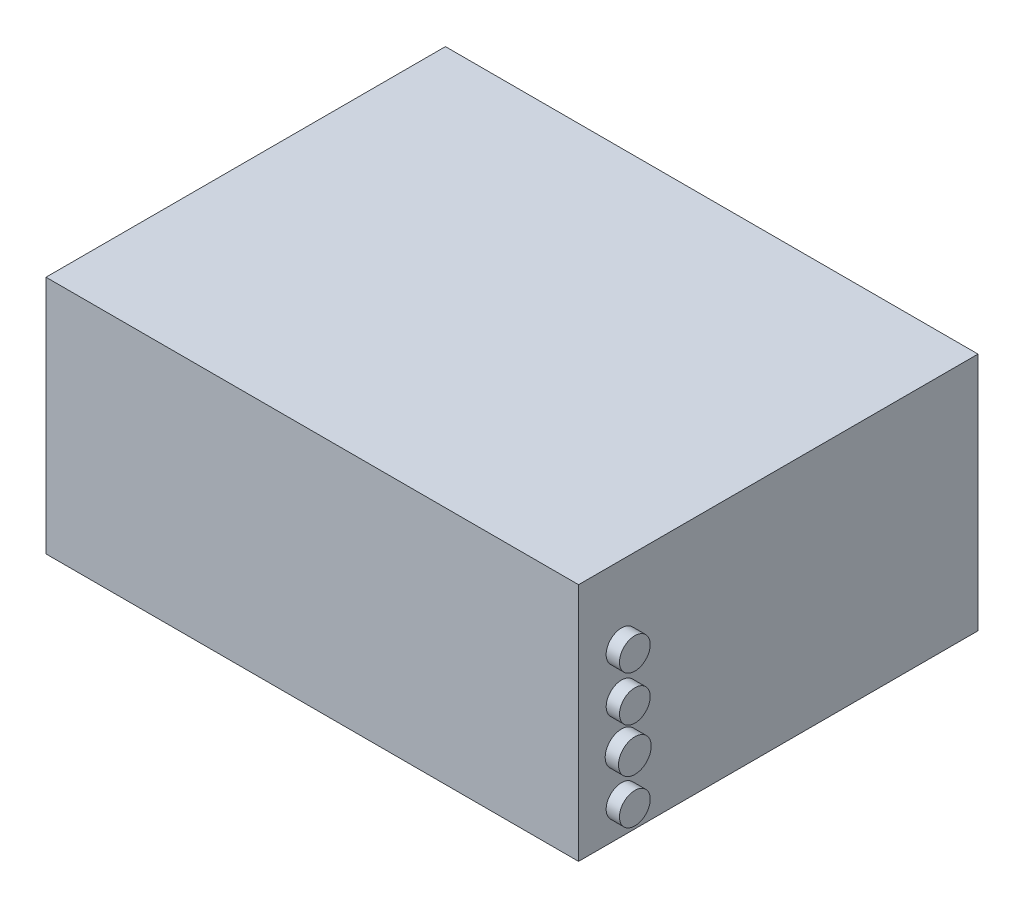
ISO-10303-21;
HEADER;
FILE_DESCRIPTION(('STEP AP214'),'2;1');
FILE_NAME('part.step','',(''),(''),'','','');
FILE_SCHEMA(('AUTOMOTIVE_DESIGN { 1 0 10303 214 1 1 1 1 }'));
ENDSEC;
DATA;
#1=APPLICATION_CONTEXT('core data for automotive mechanical design processes');
#2=APPLICATION_PROTOCOL_DEFINITION('international standard','automotive_design',2000,#1);
#3=PRODUCT_CONTEXT('',#1,'mechanical');
#4=PRODUCT('Part','Part','',(#3));
#5=PRODUCT_RELATED_PRODUCT_CATEGORY('part','',(#4));
#6=PRODUCT_DEFINITION_FORMATION('','',#4);
#7=PRODUCT_DEFINITION_CONTEXT('part definition',#1,'design');
#8=PRODUCT_DEFINITION('design','',#6,#7);
#9=PRODUCT_DEFINITION_SHAPE('','',#8);
#10=(LENGTH_UNIT() NAMED_UNIT(*) SI_UNIT(.MILLI.,.METRE.));
#11=(NAMED_UNIT(*) PLANE_ANGLE_UNIT() SI_UNIT($,.RADIAN.));
#12=(NAMED_UNIT(*) SI_UNIT($,.STERADIAN.) SOLID_ANGLE_UNIT());
#13=UNCERTAINTY_MEASURE_WITH_UNIT(LENGTH_MEASURE(1.E-05),#10,'distance_accuracy_value','');
#14=(GEOMETRIC_REPRESENTATION_CONTEXT(3) GLOBAL_UNCERTAINTY_ASSIGNED_CONTEXT((#13)) GLOBAL_UNIT_ASSIGNED_CONTEXT((#10,
#11,#12)) REPRESENTATION_CONTEXT('',''));
#15=CARTESIAN_POINT('',(0.,0.,0.));
#16=DIRECTION('',(0.,0.,1.));
#17=DIRECTION('',(1.,0.,0.));
#18=AXIS2_PLACEMENT_3D('',#15,#16,#17);
#19=CARTESIAN_POINT('',(100.,90.,-75.));
#20=DIRECTION('',(-1.,0.,0.));
#21=DIRECTION('',(0.,0.,1.));
#22=AXIS2_PLACEMENT_3D('',#19,#20,#21);
#23=PLANE('',#22);
#24=CARTESIAN_POINT('',(100.,62.0845176881401,58.8639291254986));
#25=DIRECTION('',(-1.,0.,0.));
#26=DIRECTION('',(0.,0.,1.));
#27=AXIS2_PLACEMENT_3D('',#24,#25,#26);
#28=CIRCLE('',#27,5.78009430648381);
#29=CARTESIAN_POINT('',(100.,62.0845176881401,64.6440234319824));
#30=VERTEX_POINT('',#29);
#31=EDGE_CURVE('E11',#30,#30,#28,.F.);
#32=ORIENTED_EDGE('',*,*,#31,.F.);
#33=EDGE_LOOP('',(#32));
#34=FACE_BOUND('',#33,.T.);
#35=CARTESIAN_POINT('',(100.,45.1553137971656,58.8639291254986));
#36=DIRECTION('',(-1.,0.,0.));
#37=DIRECTION('',(0.,0.,1.));
#38=AXIS2_PLACEMENT_3D('',#35,#36,#37);
#39=CIRCLE('',#38,5.76546906701598);
#40=CARTESIAN_POINT('',(100.,45.1553137971656,64.6293981925146));
#41=VERTEX_POINT('',#40);
#42=EDGE_CURVE('E45',#41,#41,#39,.F.);
#43=ORIENTED_EDGE('',*,*,#42,.F.);
#44=EDGE_LOOP('',(#43));
#45=FACE_BOUND('',#44,.T.);
#46=CARTESIAN_POINT('',(100.,28.8473650948507,58.8639291254986));
#47=DIRECTION('',(-1.,0.,0.));
#48=DIRECTION('',(0.,0.,1.));
#49=AXIS2_PLACEMENT_3D('',#46,#47,#48);
#50=CIRCLE('',#49,6.14422637913083);
#51=CARTESIAN_POINT('',(100.,28.8473650948507,65.0081555046294));
#52=VERTEX_POINT('',#51);
#53=EDGE_CURVE('E129',#52,#52,#50,.F.);
#54=ORIENTED_EDGE('',*,*,#53,.F.);
#55=EDGE_LOOP('',(#54));
#56=FACE_BOUND('',#55,.T.);
#57=CARTESIAN_POINT('',(100.,11.7628474067113,58.8639291254986));
#58=DIRECTION('',(-1.,0.,0.));
#59=DIRECTION('',(0.,0.,1.));
#60=AXIS2_PLACEMENT_3D('',#57,#58,#59);
#61=CIRCLE('',#60,5.77800725304641);
#62=CARTESIAN_POINT('',(100.,11.7628474067113,64.641936378545));
#63=VERTEX_POINT('',#62);
#64=EDGE_CURVE('E126',#63,#63,#61,.F.);
#65=ORIENTED_EDGE('',*,*,#64,.F.);
#66=EDGE_LOOP('',(#65));
#67=FACE_BOUND('',#66,.T.);
#68=DIRECTION('',(0.,0.,-1.));
#69=VECTOR('',#68,1.);
#70=CARTESIAN_POINT('',(100.,0.,-75.));
#71=LINE('',#70,#69);
#72=CARTESIAN_POINT('',(100.,0.,75.));
#73=VERTEX_POINT('',#72);
#74=CARTESIAN_POINT('',(100.,0.,-75.));
#75=VERTEX_POINT('',#74);
#76=EDGE_CURVE('E104',#73,#75,#71,.T.);
#77=ORIENTED_EDGE('',*,*,#76,.T.);
#78=DIRECTION('',(0.,-1.,0.));
#79=VECTOR('',#78,1.);
#80=CARTESIAN_POINT('',(100.,90.,-75.));
#81=LINE('',#80,#79);
#82=CARTESIAN_POINT('',(100.,90.,-75.));
#83=VERTEX_POINT('',#82);
#84=EDGE_CURVE('E95',#83,#75,#81,.T.);
#85=ORIENTED_EDGE('',*,*,#84,.F.);
#86=DIRECTION('',(0.,0.,-1.));
#87=VECTOR('',#86,1.);
#88=CARTESIAN_POINT('',(100.,90.,-75.));
#89=LINE('',#88,#87);
#90=CARTESIAN_POINT('',(100.,90.,75.));
#91=VERTEX_POINT('',#90);
#92=EDGE_CURVE('E89',#91,#83,#89,.T.);
#93=ORIENTED_EDGE('',*,*,#92,.F.);
#94=DIRECTION('',(0.,-1.,0.));
#95=VECTOR('',#94,1.);
#96=CARTESIAN_POINT('',(100.,90.,75.));
#97=LINE('',#96,#95);
#98=EDGE_CURVE('E100',#91,#73,#97,.T.);
#99=ORIENTED_EDGE('',*,*,#98,.T.);
#100=EDGE_LOOP('',(#77,#85,#93,#99));
#101=FACE_BOUND('',#100,.T.);
#102=ADVANCED_FACE('F37',(#34,#45,#56,#67,#101),#23,.F.);
#103=CARTESIAN_POINT('',(-100.,90.,-75.));
#104=DIRECTION('',(0.,0.,1.));
#105=DIRECTION('',(1.,0.,0.));
#106=AXIS2_PLACEMENT_3D('',#103,#104,#105);
#107=PLANE('',#106);
#108=DIRECTION('',(-1.,0.,0.));
#109=VECTOR('',#108,1.);
#110=CARTESIAN_POINT('',(-100.,0.,-75.));
#111=LINE('',#110,#109);
#112=CARTESIAN_POINT('',(-100.,0.,-75.));
#113=VERTEX_POINT('',#112);
#114=EDGE_CURVE('E94',#75,#113,#111,.T.);
#115=ORIENTED_EDGE('',*,*,#114,.T.);
#116=DIRECTION('',(0.,-1.,0.));
#117=VECTOR('',#116,1.);
#118=CARTESIAN_POINT('',(-100.,90.,-75.));
#119=LINE('',#118,#117);
#120=CARTESIAN_POINT('',(-100.,90.,-75.));
#121=VERTEX_POINT('',#120);
#122=EDGE_CURVE('E92',#121,#113,#119,.T.);
#123=ORIENTED_EDGE('',*,*,#122,.F.);
#124=DIRECTION('',(-1.,0.,0.));
#125=VECTOR('',#124,1.);
#126=CARTESIAN_POINT('',(-100.,90.,-75.));
#127=LINE('',#126,#125);
#128=EDGE_CURVE('E84',#83,#121,#127,.T.);
#129=ORIENTED_EDGE('',*,*,#128,.F.);
#130=ORIENTED_EDGE('',*,*,#84,.T.);
#131=EDGE_LOOP('',(#115,#123,#129,#130));
#132=FACE_BOUND('',#131,.T.);
#133=ADVANCED_FACE('F93',(#132),#107,.F.);
#134=CARTESIAN_POINT('',(-100.,90.,-75.));
#135=DIRECTION('',(1.,0.,0.));
#136=DIRECTION('',(0.,0.,-1.));
#137=AXIS2_PLACEMENT_3D('',#134,#135,#136);
#138=PLANE('',#137);
#139=CARTESIAN_POINT('',(-100.,62.0845176881401,58.8639291254986));
#140=DIRECTION('',(1.,0.,0.));
#141=DIRECTION('',(0.,0.,-1.));
#142=AXIS2_PLACEMENT_3D('',#139,#140,#141);
#143=CIRCLE('',#142,5.78009430648381);
#144=CARTESIAN_POINT('',(-100.,62.0845176881401,53.0838348190148));
#145=VERTEX_POINT('',#144);
#146=EDGE_CURVE('E123',#145,#145,#143,.F.);
#147=ORIENTED_EDGE('',*,*,#146,.F.);
#148=EDGE_LOOP('',(#147));
#149=FACE_BOUND('',#148,.T.);
#150=CARTESIAN_POINT('',(-100.,45.1553137971656,58.8639291254986));
#151=DIRECTION('',(1.,0.,0.));
#152=DIRECTION('',(0.,0.,-1.));
#153=AXIS2_PLACEMENT_3D('',#150,#151,#152);
#154=CIRCLE('',#153,5.76546906701598);
#155=CARTESIAN_POINT('',(-100.,45.1553137971656,53.0984600584826));
#156=VERTEX_POINT('',#155);
#157=EDGE_CURVE('E120',#156,#156,#154,.F.);
#158=ORIENTED_EDGE('',*,*,#157,.F.);
#159=EDGE_LOOP('',(#158));
#160=FACE_BOUND('',#159,.T.);
#161=CARTESIAN_POINT('',(-100.,28.8473650948507,58.8639291254986));
#162=DIRECTION('',(1.,0.,0.));
#163=DIRECTION('',(0.,0.,-1.));
#164=AXIS2_PLACEMENT_3D('',#161,#162,#163);
#165=CIRCLE('',#164,6.14422637913083);
#166=CARTESIAN_POINT('',(-100.,28.8473650948507,52.7197027463678));
#167=VERTEX_POINT('',#166);
#168=EDGE_CURVE('E117',#167,#167,#165,.F.);
#169=ORIENTED_EDGE('',*,*,#168,.F.);
#170=EDGE_LOOP('',(#169));
#171=FACE_BOUND('',#170,.T.);
#172=CARTESIAN_POINT('',(-100.,11.7628474067113,58.8639291254986));
#173=DIRECTION('',(1.,0.,0.));
#174=DIRECTION('',(0.,0.,-1.));
#175=AXIS2_PLACEMENT_3D('',#172,#173,#174);
#176=CIRCLE('',#175,5.77800725304641);
#177=CARTESIAN_POINT('',(-100.,11.7628474067113,53.0859218724522));
#178=VERTEX_POINT('',#177);
#179=EDGE_CURVE('E114',#178,#178,#176,.F.);
#180=ORIENTED_EDGE('',*,*,#179,.F.);
#181=EDGE_LOOP('',(#180));
#182=FACE_BOUND('',#181,.T.);
#183=DIRECTION('',(0.,0.,1.));
#184=VECTOR('',#183,1.);
#185=CARTESIAN_POINT('',(-100.,0.,-75.));
#186=LINE('',#185,#184);
#187=CARTESIAN_POINT('',(-100.,0.,75.));
#188=VERTEX_POINT('',#187);
#189=EDGE_CURVE('E70',#113,#188,#186,.T.);
#190=ORIENTED_EDGE('',*,*,#189,.T.);
#191=DIRECTION('',(0.,-1.,0.));
#192=VECTOR('',#191,1.);
#193=CARTESIAN_POINT('',(-100.,90.,75.));
#194=LINE('',#193,#192);
#195=CARTESIAN_POINT('',(-100.,90.,75.));
#196=VERTEX_POINT('',#195);
#197=EDGE_CURVE('E96',#196,#188,#194,.T.);
#198=ORIENTED_EDGE('',*,*,#197,.F.);
#199=DIRECTION('',(0.,0.,1.));
#200=VECTOR('',#199,1.);
#201=CARTESIAN_POINT('',(-100.,90.,-75.));
#202=LINE('',#201,#200);
#203=EDGE_CURVE('E87',#121,#196,#202,.T.);
#204=ORIENTED_EDGE('',*,*,#203,.F.);
#205=ORIENTED_EDGE('',*,*,#122,.T.);
#206=EDGE_LOOP('',(#190,#198,#204,#205));
#207=FACE_BOUND('',#206,.T.);
#208=ADVANCED_FACE('F98',(#149,#160,#171,#182,#207),#138,.F.);
#209=CARTESIAN_POINT('',(-100.,90.,75.));
#210=DIRECTION('',(0.,0.,-1.));
#211=DIRECTION('',(-1.,0.,0.));
#212=AXIS2_PLACEMENT_3D('',#209,#210,#211);
#213=PLANE('',#212);
#214=DIRECTION('',(1.,0.,0.));
#215=VECTOR('',#214,1.);
#216=CARTESIAN_POINT('',(-100.,0.,75.));
#217=LINE('',#216,#215);
#218=EDGE_CURVE('E76',#188,#73,#217,.T.);
#219=ORIENTED_EDGE('',*,*,#218,.T.);
#220=ORIENTED_EDGE('',*,*,#98,.F.);
#221=DIRECTION('',(1.,0.,0.));
#222=VECTOR('',#221,1.);
#223=CARTESIAN_POINT('',(-100.,90.,75.));
#224=LINE('',#223,#222);
#225=EDGE_CURVE('E53',#196,#91,#224,.T.);
#226=ORIENTED_EDGE('',*,*,#225,.F.);
#227=ORIENTED_EDGE('',*,*,#197,.T.);
#228=EDGE_LOOP('',(#219,#220,#226,#227));
#229=FACE_BOUND('',#228,.T.);
#230=ADVANCED_FACE('F157',(#229),#213,.F.);
#231=CARTESIAN_POINT('',(0.,90.,0.));
#232=DIRECTION('',(0.,1.,0.));
#233=DIRECTION('',(0.,0.,1.));
#234=AXIS2_PLACEMENT_3D('',#231,#232,#233);
#235=PLANE('',#234);
#236=ORIENTED_EDGE('',*,*,#92,.T.);
#237=ORIENTED_EDGE('',*,*,#128,.T.);
#238=ORIENTED_EDGE('',*,*,#203,.T.);
#239=ORIENTED_EDGE('',*,*,#225,.T.);
#240=EDGE_LOOP('',(#236,#237,#238,#239));
#241=FACE_BOUND('',#240,.T.);
#242=ADVANCED_FACE('F85',(#241),#235,.T.);
#243=CARTESIAN_POINT('',(0.,0.,0.));
#244=DIRECTION('',(0.,1.,0.));
#245=DIRECTION('',(0.,0.,1.));
#246=AXIS2_PLACEMENT_3D('',#243,#244,#245);
#247=PLANE('',#246);
#248=ORIENTED_EDGE('',*,*,#76,.F.);
#249=ORIENTED_EDGE('',*,*,#218,.F.);
#250=ORIENTED_EDGE('',*,*,#189,.F.);
#251=ORIENTED_EDGE('',*,*,#114,.F.);
#252=EDGE_LOOP('',(#248,#249,#250,#251));
#253=FACE_BOUND('',#252,.T.);
#254=ADVANCED_FACE('F146',(#253),#247,.F.);
#255=CARTESIAN_POINT('',(-105.,11.7628474067113,58.8639291254986));
#256=DIRECTION('',(1.,0.,0.));
#257=DIRECTION('',(0.,0.,-1.));
#258=AXIS2_PLACEMENT_3D('',#255,#256,#257);
#259=CYLINDRICAL_SURFACE('',#258,5.77800725304641);
#260=CARTESIAN_POINT('',(-105.,11.7628474067113,58.8639291254986));
#261=DIRECTION('',(-1.,0.,0.));
#262=DIRECTION('',(0.,0.,1.));
#263=AXIS2_PLACEMENT_3D('',#260,#261,#262);
#264=CIRCLE('',#263,5.77800725304641);
#265=CARTESIAN_POINT('',(-105.,11.7628474067113,64.641936378545));
#266=VERTEX_POINT('',#265);
#267=EDGE_CURVE('E107',#266,#266,#264,.T.);
#268=ORIENTED_EDGE('',*,*,#267,.F.);
#269=EDGE_LOOP('',(#268));
#270=FACE_BOUND('',#269,.T.);
#271=ORIENTED_EDGE('',*,*,#179,.T.);
#272=EDGE_LOOP('',(#271));
#273=FACE_BOUND('',#272,.T.);
#274=ADVANCED_FACE('F148',(#270,#273),#259,.T.);
#275=CARTESIAN_POINT('',(-105.,11.7628474067113,58.8639291254986));
#276=DIRECTION('',(-1.,0.,0.));
#277=DIRECTION('',(0.,0.,1.));
#278=AXIS2_PLACEMENT_3D('',#275,#276,#277);
#279=PLANE('',#278);
#280=ORIENTED_EDGE('',*,*,#267,.T.);
#281=EDGE_LOOP('',(#280));
#282=FACE_BOUND('',#281,.T.);
#283=ADVANCED_FACE('F154',(#282),#279,.T.);
#284=CARTESIAN_POINT('',(-105.,28.8473650948507,58.8639291254986));
#285=DIRECTION('',(1.,0.,0.));
#286=DIRECTION('',(0.,0.,-1.));
#287=AXIS2_PLACEMENT_3D('',#284,#285,#286);
#288=CYLINDRICAL_SURFACE('',#287,6.14422637913083);
#289=CARTESIAN_POINT('',(-105.,28.8473650948507,58.8639291254986));
#290=DIRECTION('',(-1.,0.,0.));
#291=DIRECTION('',(0.,0.,1.));
#292=AXIS2_PLACEMENT_3D('',#289,#290,#291);
#293=CIRCLE('',#292,6.14422637913083);
#294=CARTESIAN_POINT('',(-105.,28.8473650948507,65.0081555046294));
#295=VERTEX_POINT('',#294);
#296=EDGE_CURVE('E398',#295,#295,#293,.T.);
#297=ORIENTED_EDGE('',*,*,#296,.F.);
#298=EDGE_LOOP('',(#297));
#299=FACE_BOUND('',#298,.T.);
#300=ORIENTED_EDGE('',*,*,#168,.T.);
#301=EDGE_LOOP('',(#300));
#302=FACE_BOUND('',#301,.T.);
#303=ADVANCED_FACE('F206',(#299,#302),#288,.T.);
#304=CARTESIAN_POINT('',(-105.,28.8473650948507,58.8639291254986));
#305=DIRECTION('',(-1.,0.,0.));
#306=DIRECTION('',(0.,0.,1.));
#307=AXIS2_PLACEMENT_3D('',#304,#305,#306);
#308=PLANE('',#307);
#309=ORIENTED_EDGE('',*,*,#296,.T.);
#310=EDGE_LOOP('',(#309));
#311=FACE_BOUND('',#310,.T.);
#312=ADVANCED_FACE('F217',(#311),#308,.T.);
#313=CARTESIAN_POINT('',(-105.,45.1553137971656,58.8639291254986));
#314=DIRECTION('',(1.,0.,0.));
#315=DIRECTION('',(0.,0.,-1.));
#316=AXIS2_PLACEMENT_3D('',#313,#314,#315);
#317=CYLINDRICAL_SURFACE('',#316,5.76546906701598);
#318=CARTESIAN_POINT('',(-105.,45.1553137971656,58.8639291254986));
#319=DIRECTION('',(-1.,0.,0.));
#320=DIRECTION('',(0.,0.,1.));
#321=AXIS2_PLACEMENT_3D('',#318,#319,#320);
#322=CIRCLE('',#321,5.76546906701598);
#323=CARTESIAN_POINT('',(-105.,45.1553137971656,64.6293981925146));
#324=VERTEX_POINT('',#323);
#325=EDGE_CURVE('E395',#324,#324,#322,.T.);
#326=ORIENTED_EDGE('',*,*,#325,.F.);
#327=EDGE_LOOP('',(#326));
#328=FACE_BOUND('',#327,.T.);
#329=ORIENTED_EDGE('',*,*,#157,.T.);
#330=EDGE_LOOP('',(#329));
#331=FACE_BOUND('',#330,.T.);
#332=ADVANCED_FACE('F228',(#328,#331),#317,.T.);
#333=CARTESIAN_POINT('',(-105.,45.1553137971656,58.8639291254986));
#334=DIRECTION('',(-1.,0.,0.));
#335=DIRECTION('',(0.,0.,1.));
#336=AXIS2_PLACEMENT_3D('',#333,#334,#335);
#337=PLANE('',#336);
#338=ORIENTED_EDGE('',*,*,#325,.T.);
#339=EDGE_LOOP('',(#338));
#340=FACE_BOUND('',#339,.T.);
#341=ADVANCED_FACE('F239',(#340),#337,.T.);
#342=CARTESIAN_POINT('',(-105.,62.0845176881401,58.8639291254986));
#343=DIRECTION('',(1.,0.,0.));
#344=DIRECTION('',(0.,0.,-1.));
#345=AXIS2_PLACEMENT_3D('',#342,#343,#344);
#346=CYLINDRICAL_SURFACE('',#345,5.78009430648381);
#347=CARTESIAN_POINT('',(-105.,62.0845176881401,58.8639291254986));
#348=DIRECTION('',(-1.,0.,0.));
#349=DIRECTION('',(0.,0.,1.));
#350=AXIS2_PLACEMENT_3D('',#347,#348,#349);
#351=CIRCLE('',#350,5.78009430648381);
#352=CARTESIAN_POINT('',(-105.,62.0845176881401,64.6440234319824));
#353=VERTEX_POINT('',#352);
#354=EDGE_CURVE('E392',#353,#353,#351,.T.);
#355=ORIENTED_EDGE('',*,*,#354,.F.);
#356=EDGE_LOOP('',(#355));
#357=FACE_BOUND('',#356,.T.);
#358=ORIENTED_EDGE('',*,*,#146,.T.);
#359=EDGE_LOOP('',(#358));
#360=FACE_BOUND('',#359,.T.);
#361=ADVANCED_FACE('F250',(#357,#360),#346,.T.);
#362=CARTESIAN_POINT('',(-105.,62.0845176881401,58.8639291254986));
#363=DIRECTION('',(-1.,0.,0.));
#364=DIRECTION('',(0.,0.,1.));
#365=AXIS2_PLACEMENT_3D('',#362,#363,#364);
#366=PLANE('',#365);
#367=ORIENTED_EDGE('',*,*,#354,.T.);
#368=EDGE_LOOP('',(#367));
#369=FACE_BOUND('',#368,.T.);
#370=ADVANCED_FACE('F261',(#369),#366,.T.);
#371=CARTESIAN_POINT('',(100.,11.7628474067113,58.8639291254986));
#372=DIRECTION('',(1.,0.,0.));
#373=DIRECTION('',(0.,0.,-1.));
#374=AXIS2_PLACEMENT_3D('',#371,#372,#373);
#375=CYLINDRICAL_SURFACE('',#374,5.77800725304641);
#376=ORIENTED_EDGE('',*,*,#64,.T.);
#377=EDGE_LOOP('',(#376));
#378=FACE_BOUND('',#377,.T.);
#379=CARTESIAN_POINT('',(105.,11.7628474067113,58.8639291254986));
#380=DIRECTION('',(-1.,0.,0.));
#381=DIRECTION('',(0.,0.,1.));
#382=AXIS2_PLACEMENT_3D('',#379,#380,#381);
#383=CIRCLE('',#382,5.77800725304641);
#384=CARTESIAN_POINT('',(105.,11.7628474067113,64.641936378545));
#385=VERTEX_POINT('',#384);
#386=EDGE_CURVE('E389',#385,#385,#383,.T.);
#387=ORIENTED_EDGE('',*,*,#386,.T.);
#388=EDGE_LOOP('',(#387));
#389=FACE_BOUND('',#388,.T.);
#390=ADVANCED_FACE('F272',(#378,#389),#375,.T.);
#391=CARTESIAN_POINT('',(105.,11.7628474067113,58.8639291254986));
#392=DIRECTION('',(-1.,0.,0.));
#393=DIRECTION('',(0.,0.,1.));
#394=AXIS2_PLACEMENT_3D('',#391,#392,#393);
#395=PLANE('',#394);
#396=ORIENTED_EDGE('',*,*,#386,.F.);
#397=EDGE_LOOP('',(#396));
#398=FACE_BOUND('',#397,.T.);
#399=ADVANCED_FACE('F283',(#398),#395,.F.);
#400=CARTESIAN_POINT('',(100.,28.8473650948507,58.8639291254986));
#401=DIRECTION('',(1.,0.,0.));
#402=DIRECTION('',(0.,0.,-1.));
#403=AXIS2_PLACEMENT_3D('',#400,#401,#402);
#404=CYLINDRICAL_SURFACE('',#403,6.14422637913083);
#405=ORIENTED_EDGE('',*,*,#53,.T.);
#406=EDGE_LOOP('',(#405));
#407=FACE_BOUND('',#406,.T.);
#408=CARTESIAN_POINT('',(105.,28.8473650948507,58.8639291254986));
#409=DIRECTION('',(-1.,0.,0.));
#410=DIRECTION('',(0.,0.,1.));
#411=AXIS2_PLACEMENT_3D('',#408,#409,#410);
#412=CIRCLE('',#411,6.14422637913083);
#413=CARTESIAN_POINT('',(105.,28.8473650948507,65.0081555046294));
#414=VERTEX_POINT('',#413);
#415=EDGE_CURVE('E384',#414,#414,#412,.T.);
#416=ORIENTED_EDGE('',*,*,#415,.T.);
#417=EDGE_LOOP('',(#416));
#418=FACE_BOUND('',#417,.T.);
#419=ADVANCED_FACE('F294',(#407,#418),#404,.T.);
#420=CARTESIAN_POINT('',(105.,28.8473650948507,58.8639291254986));
#421=DIRECTION('',(-1.,0.,0.));
#422=DIRECTION('',(0.,0.,1.));
#423=AXIS2_PLACEMENT_3D('',#420,#421,#422);
#424=PLANE('',#423);
#425=ORIENTED_EDGE('',*,*,#415,.F.);
#426=EDGE_LOOP('',(#425));
#427=FACE_BOUND('',#426,.T.);
#428=ADVANCED_FACE('F305',(#427),#424,.F.);
#429=CARTESIAN_POINT('',(100.,45.1553137971656,58.8639291254986));
#430=DIRECTION('',(1.,0.,0.));
#431=DIRECTION('',(0.,0.,-1.));
#432=AXIS2_PLACEMENT_3D('',#429,#430,#431);
#433=CYLINDRICAL_SURFACE('',#432,5.76546906701598);
#434=ORIENTED_EDGE('',*,*,#42,.T.);
#435=EDGE_LOOP('',(#434));
#436=FACE_BOUND('',#435,.T.);
#437=CARTESIAN_POINT('',(105.,45.1553137971656,58.8639291254986));
#438=DIRECTION('',(-1.,0.,0.));
#439=DIRECTION('',(0.,0.,1.));
#440=AXIS2_PLACEMENT_3D('',#437,#438,#439);
#441=CIRCLE('',#440,5.76546906701598);
#442=CARTESIAN_POINT('',(105.,45.1553137971656,64.6293981925146));
#443=VERTEX_POINT('',#442);
#444=EDGE_CURVE('E381',#443,#443,#441,.T.);
#445=ORIENTED_EDGE('',*,*,#444,.T.);
#446=EDGE_LOOP('',(#445));
#447=FACE_BOUND('',#446,.T.);
#448=ADVANCED_FACE('F134',(#436,#447),#433,.T.);
#449=CARTESIAN_POINT('',(105.,45.1553137971656,58.8639291254986));
#450=DIRECTION('',(-1.,0.,0.));
#451=DIRECTION('',(0.,0.,1.));
#452=AXIS2_PLACEMENT_3D('',#449,#450,#451);
#453=PLANE('',#452);
#454=ORIENTED_EDGE('',*,*,#444,.F.);
#455=EDGE_LOOP('',(#454));
#456=FACE_BOUND('',#455,.T.);
#457=ADVANCED_FACE('F326',(#456),#453,.F.);
#458=CARTESIAN_POINT('',(100.,62.0845176881401,58.8639291254986));
#459=DIRECTION('',(1.,0.,0.));
#460=DIRECTION('',(0.,0.,-1.));
#461=AXIS2_PLACEMENT_3D('',#458,#459,#460);
#462=CYLINDRICAL_SURFACE('',#461,5.78009430648381);
#463=ORIENTED_EDGE('',*,*,#31,.T.);
#464=EDGE_LOOP('',(#463));
#465=FACE_BOUND('',#464,.T.);
#466=CARTESIAN_POINT('',(105.,62.0845176881401,58.8639291254986));
#467=DIRECTION('',(-1.,0.,0.));
#468=DIRECTION('',(0.,0.,1.));
#469=AXIS2_PLACEMENT_3D('',#466,#467,#468);
#470=CIRCLE('',#469,5.78009430648381);
#471=CARTESIAN_POINT('',(105.,62.0845176881401,64.6440234319824));
#472=VERTEX_POINT('',#471);
#473=EDGE_CURVE('E379',#472,#472,#470,.T.);
#474=ORIENTED_EDGE('',*,*,#473,.T.);
#475=EDGE_LOOP('',(#474));
#476=FACE_BOUND('',#475,.T.);
#477=ADVANCED_FACE('F336',(#465,#476),#462,.T.);
#478=CARTESIAN_POINT('',(105.,62.0845176881401,58.8639291254986));
#479=DIRECTION('',(-1.,0.,0.));
#480=DIRECTION('',(0.,0.,1.));
#481=AXIS2_PLACEMENT_3D('',#478,#479,#480);
#482=PLANE('',#481);
#483=ORIENTED_EDGE('',*,*,#473,.F.);
#484=EDGE_LOOP('',(#483));
#485=FACE_BOUND('',#484,.T.);
#486=ADVANCED_FACE('F347',(#485),#482,.F.);
#487=CLOSED_SHELL('',(#102,#133,#208,#230,#242,#254,#274,#283,#303,#312,#332,#341,#361,#370,
#390,#399,#419,#428,#448,#457,#477,#486));
#488=MANIFOLD_SOLID_BREP('B2',#487);
#489=ADVANCED_BREP_SHAPE_REPRESENTATION('',(#18,#488),#14);
#490=SHAPE_DEFINITION_REPRESENTATION(#9,#489);
ENDSEC;
END-ISO-10303-21;
